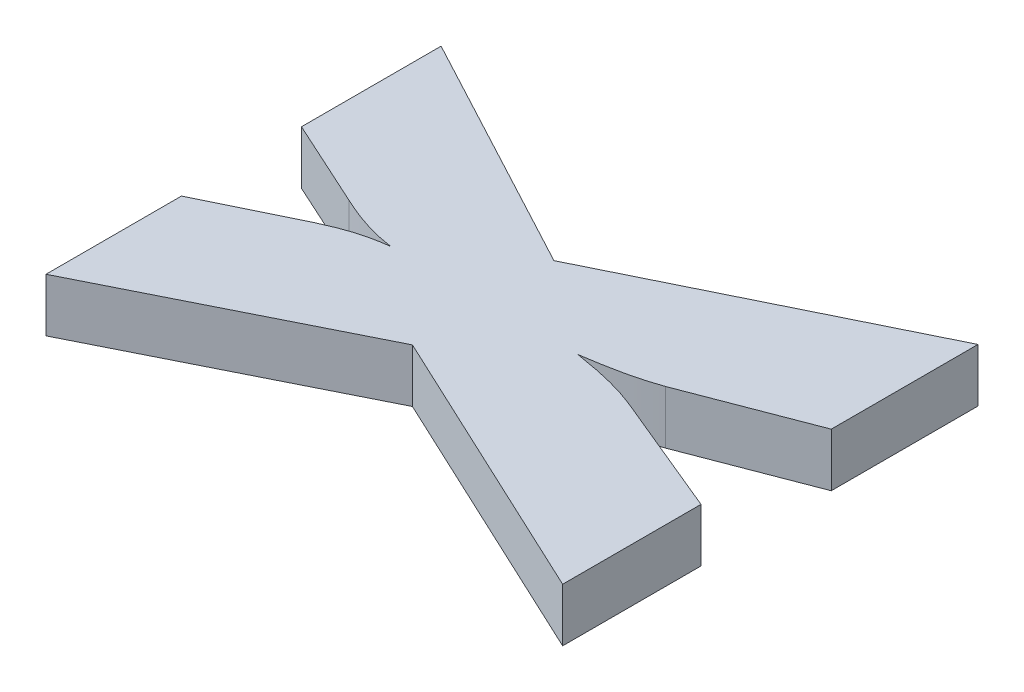
ISO-10303-21;
HEADER;
FILE_DESCRIPTION(('STEP AP214'),'2;1');
FILE_NAME('part.step','',(''),(''),'','','');
FILE_SCHEMA(('AUTOMOTIVE_DESIGN { 1 0 10303 214 1 1 1 1 }'));
ENDSEC;
DATA;
#1=APPLICATION_CONTEXT('core data for automotive mechanical design processes');
#2=APPLICATION_PROTOCOL_DEFINITION('international standard','automotive_design',2000,#1);
#3=PRODUCT_CONTEXT('',#1,'mechanical');
#4=PRODUCT('Part','Part','',(#3));
#5=PRODUCT_RELATED_PRODUCT_CATEGORY('part','',(#4));
#6=PRODUCT_DEFINITION_FORMATION('','',#4);
#7=PRODUCT_DEFINITION_CONTEXT('part definition',#1,'design');
#8=PRODUCT_DEFINITION('design','',#6,#7);
#9=PRODUCT_DEFINITION_SHAPE('','',#8);
#10=(LENGTH_UNIT() NAMED_UNIT(*) SI_UNIT(.MILLI.,.METRE.));
#11=(NAMED_UNIT(*) PLANE_ANGLE_UNIT() SI_UNIT($,.RADIAN.));
#12=(NAMED_UNIT(*) SI_UNIT($,.STERADIAN.) SOLID_ANGLE_UNIT());
#13=UNCERTAINTY_MEASURE_WITH_UNIT(LENGTH_MEASURE(1.E-05),#10,'distance_accuracy_value','');
#14=(GEOMETRIC_REPRESENTATION_CONTEXT(3) GLOBAL_UNCERTAINTY_ASSIGNED_CONTEXT((#13)) GLOBAL_UNIT_ASSIGNED_CONTEXT((#10,
#11,#12)) REPRESENTATION_CONTEXT('',''));
#15=CARTESIAN_POINT('',(0.,0.,0.));
#16=DIRECTION('',(0.,0.,1.));
#17=DIRECTION('',(1.,0.,0.));
#18=AXIS2_PLACEMENT_3D('',#15,#16,#17);
#19=CARTESIAN_POINT('',(2.55,2.9956,1.5724228896104));
#20=DIRECTION('',(1.,0.,0.));
#21=DIRECTION('',(0.,-1.,0.));
#22=AXIS2_PLACEMENT_3D('',#19,#20,#21);
#23=PLANE('',#22);
#24=DIRECTION('',(0.,0.,1.));
#25=VECTOR('',#24,1.);
#26=CARTESIAN_POINT('',(2.55,2.9306,1.5724228896104));
#27=LINE('',#26,#25);
#28=CARTESIAN_POINT('',(2.55,2.9306,1.5724228896104));
#29=VERTEX_POINT('',#28);
#30=CARTESIAN_POINT('',(2.55,2.9306,1.7409090909091));
#31=VERTEX_POINT('',#30);
#32=EDGE_CURVE('E11',#29,#31,#27,.T.);
#33=ORIENTED_EDGE('',*,*,#32,.F.);
#34=DIRECTION('',(0.,-1.,0.));
#35=VECTOR('',#34,1.);
#36=CARTESIAN_POINT('',(2.55,2.9956,1.5724228896104));
#37=LINE('',#36,#35);
#38=CARTESIAN_POINT('',(2.55,2.9956,1.5724228896104));
#39=VERTEX_POINT('',#38);
#40=EDGE_CURVE('E24',#39,#29,#37,.T.);
#41=ORIENTED_EDGE('',*,*,#40,.F.);
#42=DIRECTION('',(0.,0.,1.));
#43=VECTOR('',#42,1.);
#44=CARTESIAN_POINT('',(2.55,2.9956,1.5724228896104));
#45=LINE('',#44,#43);
#46=CARTESIAN_POINT('',(2.55,2.9956,1.7409090909091));
#47=VERTEX_POINT('',#46);
#48=EDGE_CURVE('E309',#39,#47,#45,.T.);
#49=ORIENTED_EDGE('',*,*,#48,.T.);
#50=DIRECTION('',(0.,-1.,0.));
#51=VECTOR('',#50,1.);
#52=CARTESIAN_POINT('',(2.55,2.9956,1.7409090909091));
#53=LINE('',#52,#51);
#54=EDGE_CURVE('E150',#47,#31,#53,.T.);
#55=ORIENTED_EDGE('',*,*,#54,.T.);
#56=EDGE_LOOP('',(#33,#41,#49,#55));
#57=FACE_BOUND('',#56,.T.);
#58=ADVANCED_FACE('F17',(#57),#23,.T.);
#59=CARTESIAN_POINT('',(2.4029119318182,2.9956,1.5115056818182));
#60=DIRECTION('',(0.382636975883437,0.,-0.923898774047665));
#61=DIRECTION('',(-0.923898774047665,0.,-0.382636975883437));
#62=AXIS2_PLACEMENT_3D('',#59,#60,#61);
#63=PLANE('',#62);
#64=DIRECTION('',(0.923898774047665,0.,0.382636975883437));
#65=VECTOR('',#64,1.);
#66=CARTESIAN_POINT('',(2.4029119318182,2.9306,1.5115056818182));
#67=LINE('',#66,#65);
#68=CARTESIAN_POINT('',(2.4029119318182,2.9306,1.5115056818182));
#69=VERTEX_POINT('',#68);
#70=EDGE_CURVE('E306',#69,#29,#67,.T.);
#71=ORIENTED_EDGE('',*,*,#70,.F.);
#72=DIRECTION('',(0.,-1.,0.));
#73=VECTOR('',#72,1.);
#74=CARTESIAN_POINT('',(2.4029119318182,2.9956,1.5115056818182));
#75=LINE('',#74,#73);
#76=CARTESIAN_POINT('',(2.4029119318182,2.9956,1.5115056818182));
#77=VERTEX_POINT('',#76);
#78=EDGE_CURVE('E303',#77,#69,#75,.T.);
#79=ORIENTED_EDGE('',*,*,#78,.F.);
#80=DIRECTION('',(0.923898774047665,0.,0.382636975883437));
#81=VECTOR('',#80,1.);
#82=CARTESIAN_POINT('',(2.4029119318182,2.9956,1.5115056818182));
#83=LINE('',#82,#81);
#84=EDGE_CURVE('E297',#77,#39,#83,.T.);
#85=ORIENTED_EDGE('',*,*,#84,.T.);
#86=ORIENTED_EDGE('',*,*,#40,.T.);
#87=EDGE_LOOP('',(#71,#79,#85,#86));
#88=FACE_BOUND('',#87,.T.);
#89=ADVANCED_FACE('F311',(#88),#63,.T.);
#90=CARTESIAN_POINT('',(2.3171266233766,2.9956,1.4893364448052));
#91=CARTESIAN_POINT('',(2.3171266233766,2.9306,1.4893364448052));
#92=CARTESIAN_POINT('',(2.3251736277623,2.9956,1.4906735569569));
#93=CARTESIAN_POINT('',(2.3251736277623,2.9306,1.4906735569569));
#94=CARTESIAN_POINT('',(2.3407576884877,2.9956,1.493263046905));
#95=CARTESIAN_POINT('',(2.3407576884877,2.9306,1.493263046905));
#96=CARTESIAN_POINT('',(2.3631647904249,2.9956,1.4982782669108));
#97=CARTESIAN_POINT('',(2.3631647904249,2.9306,1.4982782669108));
#98=CARTESIAN_POINT('',(2.3838381065138,2.9956,1.5040867868663));
#99=CARTESIAN_POINT('',(2.3838381065138,2.9306,1.5040867868663));
#100=CARTESIAN_POINT('',(2.3967124783538,2.9956,1.5090943619452));
#101=CARTESIAN_POINT('',(2.3967124783538,2.9306,1.5090943619452));
#102=CARTESIAN_POINT('',(2.4029119318182,2.9956,1.5115056818182));
#103=CARTESIAN_POINT('',(2.4029119318182,2.9306,1.5115056818182));
#104=B_SPLINE_SURFACE_WITH_KNOTS('',3,1,((#90,#91),(#92,#93),(#94,#95),(#96,#97),(#98,#99),
(#100,#101),(#102,#103)),.UNSPECIFIED.,.F.,.F.,.F.,(4,1,1,1,4),(2,2),(0.,0.275517741586232,
0.533575602796007,0.77540058800198,1.),(0.,1.),.UNSPECIFIED.);
#105=CARTESIAN_POINT('',(2.3171266233766,2.9306,1.4893364448052));
#106=CARTESIAN_POINT('',(2.3251736277623,2.9306,1.4906735569569));
#107=CARTESIAN_POINT('',(2.3407576884877,2.9306,1.493263046905));
#108=CARTESIAN_POINT('',(2.3631647904249,2.9306,1.4982782669108));
#109=CARTESIAN_POINT('',(2.3838381065138,2.9306,1.5040867868663));
#110=CARTESIAN_POINT('',(2.3967124783538,2.9306,1.5090943619452));
#111=CARTESIAN_POINT('',(2.4029119318182,2.9306,1.5115056818182));
#112=B_SPLINE_CURVE_WITH_KNOTS('',3,(#105,#106,#107,#108,#109,#110,#111),.UNSPECIFIED.,.F.,.F.,
(4,1,1,1,4),(0.,0.275517741586232,0.533575602796007,0.77540058800198,1.),.UNSPECIFIED.);
#113=CARTESIAN_POINT('',(2.3171266233766,2.9306,1.4893364448052));
#114=VERTEX_POINT('',#113);
#115=EDGE_CURVE('E292',#114,#69,#112,.T.);
#116=DIRECTION('',(0.,-1.,0.));
#117=VECTOR('',#116,1.);
#118=CARTESIAN_POINT('',(2.3171266233766,2.9956,1.4893364448052));
#119=LINE('',#118,#117);
#120=CARTESIAN_POINT('',(2.3171266233766,2.9956,1.4893364448052));
#121=VERTEX_POINT('',#120);
#122=EDGE_CURVE('E286',#121,#114,#119,.T.);
#123=CARTESIAN_POINT('',(2.3171266233766,2.9956,1.4893364448052));
#124=CARTESIAN_POINT('',(2.3251736277623,2.9956,1.4906735569569));
#125=CARTESIAN_POINT('',(2.3407576884877,2.9956,1.493263046905));
#126=CARTESIAN_POINT('',(2.3631647904249,2.9956,1.4982782669108));
#127=CARTESIAN_POINT('',(2.3838381065138,2.9956,1.5040867868663));
#128=CARTESIAN_POINT('',(2.3967124783538,2.9956,1.5090943619452));
#129=CARTESIAN_POINT('',(2.4029119318182,2.9956,1.5115056818182));
#130=B_SPLINE_CURVE_WITH_KNOTS('',3,(#123,#124,#125,#126,#127,#128,#129),.UNSPECIFIED.,.F.,.F.,
(4,1,1,1,4),(0.,0.275517741586232,0.533575602796007,0.77540058800198,1.),.UNSPECIFIED.);
#131=EDGE_CURVE('E278',#121,#77,#130,.T.);
#132=ORIENTED_EDGE('',*,*,#115,.F.);
#133=ORIENTED_EDGE('',*,*,#122,.F.);
#134=ORIENTED_EDGE('',*,*,#131,.T.);
#135=ORIENTED_EDGE('',*,*,#78,.T.);
#136=EDGE_LOOP('',(#132,#133,#134,#135));
#137=FACE_BOUND('',#136,.T.);
#138=ADVANCED_FACE('F315',(#137),#104,.T.);
#139=CARTESIAN_POINT('',(2.4040685876623,2.9956,1.4696732954545));
#140=CARTESIAN_POINT('',(2.4040685876623,2.9306,1.4696732954545));
#141=CARTESIAN_POINT('',(2.3978598209841,2.9956,1.4717469444771));
#142=CARTESIAN_POINT('',(2.3978598209841,2.9306,1.4717469444771));
#143=CARTESIAN_POINT('',(2.3849227760133,2.9956,1.4760677527873));
#144=CARTESIAN_POINT('',(2.3849227760133,2.9306,1.4760677527873));
#145=CARTESIAN_POINT('',(2.3642208732788,2.9956,1.4811559121503));
#146=CARTESIAN_POINT('',(2.3642208732788,2.9306,1.4811559121503));
#147=CARTESIAN_POINT('',(2.3414255606766,2.9956,1.4855771500661));
#148=CARTESIAN_POINT('',(2.3414255606766,2.9306,1.4855771500661));
#149=CARTESIAN_POINT('',(2.3254897438753,2.9956,1.4880425843164));
#150=CARTESIAN_POINT('',(2.3254897438753,2.9306,1.4880425843164));
#151=CARTESIAN_POINT('',(2.3171266233766,2.9956,1.4893364448052));
#152=CARTESIAN_POINT('',(2.3171266233766,2.9306,1.4893364448052));
#153=B_SPLINE_SURFACE_WITH_KNOTS('',3,1,((#139,#140),(#141,#142),(#143,#144),(#145,#146),(#147,
#148),(#149,#150),(#151,#152)),.UNSPECIFIED.,.F.,.F.,.F.,(4,1,1,1,4),(2,2),(0.,
0.219889080717572,0.458177134566871,0.715651229614947,1.),(0.,1.),.UNSPECIFIED.);
#154=CARTESIAN_POINT('',(2.4040685876623,2.9306,1.4696732954545));
#155=CARTESIAN_POINT('',(2.3978598209841,2.9306,1.4717469444771));
#156=CARTESIAN_POINT('',(2.3849227760133,2.9306,1.4760677527873));
#157=CARTESIAN_POINT('',(2.3642208732788,2.9306,1.4811559121503));
#158=CARTESIAN_POINT('',(2.3414255606766,2.9306,1.4855771500661));
#159=CARTESIAN_POINT('',(2.3254897438753,2.9306,1.4880425843164));
#160=CARTESIAN_POINT('',(2.3171266233766,2.9306,1.4893364448052));
#161=B_SPLINE_CURVE_WITH_KNOTS('',3,(#154,#155,#156,#157,#158,#159,#160),.UNSPECIFIED.,.F.,.F.,
(4,1,1,1,4),(0.,0.219889080717572,0.458177134566871,0.715651229614947,1.),.UNSPECIFIED.);
#162=CARTESIAN_POINT('',(2.4040685876623,2.9306,1.4696732954545));
#163=VERTEX_POINT('',#162);
#164=EDGE_CURVE('E273',#163,#114,#161,.T.);
#165=DIRECTION('',(0.,-1.,0.));
#166=VECTOR('',#165,1.);
#167=CARTESIAN_POINT('',(2.4040685876623,2.9956,1.4696732954545));
#168=LINE('',#167,#166);
#169=CARTESIAN_POINT('',(2.4040685876623,2.9956,1.4696732954545));
#170=VERTEX_POINT('',#169);
#171=EDGE_CURVE('E267',#170,#163,#168,.T.);
#172=CARTESIAN_POINT('',(2.4040685876623,2.9956,1.4696732954545));
#173=CARTESIAN_POINT('',(2.3978598209841,2.9956,1.4717469444771));
#174=CARTESIAN_POINT('',(2.3849227760133,2.9956,1.4760677527873));
#175=CARTESIAN_POINT('',(2.3642208732788,2.9956,1.4811559121503));
#176=CARTESIAN_POINT('',(2.3414255606766,2.9956,1.4855771500661));
#177=CARTESIAN_POINT('',(2.3254897438753,2.9956,1.4880425843164));
#178=CARTESIAN_POINT('',(2.3171266233766,2.9956,1.4893364448052));
#179=B_SPLINE_CURVE_WITH_KNOTS('',3,(#172,#173,#174,#175,#176,#177,#178),.UNSPECIFIED.,.F.,.F.,
(4,1,1,1,4),(0.,0.219889080717572,0.458177134566871,0.715651229614947,1.),.UNSPECIFIED.);
#180=EDGE_CURVE('E262',#170,#121,#179,.T.);
#181=ORIENTED_EDGE('',*,*,#164,.F.);
#182=ORIENTED_EDGE('',*,*,#171,.F.);
#183=ORIENTED_EDGE('',*,*,#180,.T.);
#184=ORIENTED_EDGE('',*,*,#122,.T.);
#185=EDGE_LOOP('',(#181,#182,#183,#184));
#186=FACE_BOUND('',#185,.T.);
#187=ADVANCED_FACE('F318',(#186),#153,.T.);
#188=CARTESIAN_POINT('',(2.55,2.9956,1.413768262987));
#189=DIRECTION('',(0.35773882171526,0.,0.933821682891213));
#190=DIRECTION('',(0.933821682891213,0.,-0.35773882171526));
#191=AXIS2_PLACEMENT_3D('',#188,#189,#190);
#192=PLANE('',#191);
#193=DIRECTION('',(-0.933821682891213,0.,0.35773882171526));
#194=VECTOR('',#193,1.);
#195=CARTESIAN_POINT('',(2.55,2.9306,1.413768262987));
#196=LINE('',#195,#194);
#197=CARTESIAN_POINT('',(2.55,2.9306,1.413768262987));
#198=VERTEX_POINT('',#197);
#199=EDGE_CURVE('E259',#198,#163,#196,.T.);
#200=ORIENTED_EDGE('',*,*,#199,.F.);
#201=DIRECTION('',(0.,-1.,0.));
#202=VECTOR('',#201,1.);
#203=CARTESIAN_POINT('',(2.55,2.9956,1.413768262987));
#204=LINE('',#203,#202);
#205=CARTESIAN_POINT('',(2.55,2.9956,1.413768262987));
#206=VERTEX_POINT('',#205);
#207=EDGE_CURVE('E256',#206,#198,#204,.T.);
#208=ORIENTED_EDGE('',*,*,#207,.F.);
#209=DIRECTION('',(-0.933821682891213,0.,0.35773882171526));
#210=VECTOR('',#209,1.);
#211=CARTESIAN_POINT('',(2.55,2.9956,1.413768262987));
#212=LINE('',#211,#210);
#213=EDGE_CURVE('E253',#206,#170,#212,.T.);
#214=ORIENTED_EDGE('',*,*,#213,.T.);
#215=ORIENTED_EDGE('',*,*,#171,.T.);
#216=EDGE_LOOP('',(#200,#208,#214,#215));
#217=FACE_BOUND('',#216,.T.);
#218=ADVANCED_FACE('F323',(#217),#192,.T.);
#219=CARTESIAN_POINT('',(2.55,2.9956,1.2350649350649));
#220=DIRECTION('',(1.,0.,0.));
#221=DIRECTION('',(0.,-1.,0.));
#222=AXIS2_PLACEMENT_3D('',#219,#220,#221);
#223=PLANE('',#222);
#224=DIRECTION('',(0.,0.,1.));
#225=VECTOR('',#224,1.);
#226=CARTESIAN_POINT('',(2.55,2.9306,1.2350649350649));
#227=LINE('',#226,#225);
#228=CARTESIAN_POINT('',(2.55,2.9306,1.2350649350649));
#229=VERTEX_POINT('',#228);
#230=EDGE_CURVE('E250',#229,#198,#227,.T.);
#231=ORIENTED_EDGE('',*,*,#230,.F.);
#232=DIRECTION('',(0.,-1.,0.));
#233=VECTOR('',#232,1.);
#234=CARTESIAN_POINT('',(2.55,2.9956,1.2350649350649));
#235=LINE('',#234,#233);
#236=CARTESIAN_POINT('',(2.55,2.9956,1.2350649350649));
#237=VERTEX_POINT('',#236);
#238=EDGE_CURVE('E247',#237,#229,#235,.T.);
#239=ORIENTED_EDGE('',*,*,#238,.F.);
#240=DIRECTION('',(0.,0.,1.));
#241=VECTOR('',#240,1.);
#242=CARTESIAN_POINT('',(2.55,2.9956,1.2350649350649));
#243=LINE('',#242,#241);
#244=EDGE_CURVE('E244',#237,#206,#243,.T.);
#245=ORIENTED_EDGE('',*,*,#244,.T.);
#246=ORIENTED_EDGE('',*,*,#207,.T.);
#247=EDGE_LOOP('',(#231,#239,#245,#246));
#248=FACE_BOUND('',#247,.T.);
#249=ADVANCED_FACE('F325',(#248),#223,.T.);
#250=CARTESIAN_POINT('',(2.2033887987013,2.9956,1.4049005681818));
#251=DIRECTION('',(-0.440007192910873,0.,-0.897994248415152));
#252=DIRECTION('',(-0.897994248415152,0.,0.440007192910873));
#253=AXIS2_PLACEMENT_3D('',#250,#251,#252);
#254=PLANE('',#253);
#255=DIRECTION('',(0.897994248415152,0.,-0.440007192910873));
#256=VECTOR('',#255,1.);
#257=CARTESIAN_POINT('',(2.2033887987013,2.9306,1.4049005681818));
#258=LINE('',#257,#256);
#259=CARTESIAN_POINT('',(2.2033887987013,2.9306,1.4049005681818));
#260=VERTEX_POINT('',#259);
#261=EDGE_CURVE('E241',#260,#229,#258,.T.);
#262=ORIENTED_EDGE('',*,*,#261,.F.);
#263=DIRECTION('',(0.,-1.,0.));
#264=VECTOR('',#263,1.);
#265=CARTESIAN_POINT('',(2.2033887987013,2.9956,1.4049005681818));
#266=LINE('',#265,#264);
#267=CARTESIAN_POINT('',(2.2033887987013,2.9956,1.4049005681818));
#268=VERTEX_POINT('',#267);
#269=EDGE_CURVE('E238',#268,#260,#266,.T.);
#270=ORIENTED_EDGE('',*,*,#269,.F.);
#271=DIRECTION('',(0.897994248415152,0.,-0.440007192910873));
#272=VECTOR('',#271,1.);
#273=CARTESIAN_POINT('',(2.2033887987013,2.9956,1.4049005681818));
#274=LINE('',#273,#272);
#275=EDGE_CURVE('E235',#268,#237,#274,.T.);
#276=ORIENTED_EDGE('',*,*,#275,.T.);
#277=ORIENTED_EDGE('',*,*,#238,.T.);
#278=EDGE_LOOP('',(#262,#270,#276,#277));
#279=FACE_BOUND('',#278,.T.);
#280=ADVANCED_FACE('F327',(#279),#254,.T.);
#281=CARTESIAN_POINT('',(1.9084415584416,2.9956,1.2474025974026));
#282=DIRECTION('',(0.471037041403361,0.,-0.882113431269453));
#283=DIRECTION('',(-0.882113431269453,0.,-0.471037041403361));
#284=AXIS2_PLACEMENT_3D('',#281,#282,#283);
#285=PLANE('',#284);
#286=DIRECTION('',(0.882113431269453,0.,0.471037041403361));
#287=VECTOR('',#286,1.);
#288=CARTESIAN_POINT('',(1.9084415584416,2.9306,1.2474025974026));
#289=LINE('',#288,#287);
#290=CARTESIAN_POINT('',(1.9084415584416,2.9306,1.2474025974026));
#291=VERTEX_POINT('',#290);
#292=EDGE_CURVE('E232',#291,#260,#289,.T.);
#293=ORIENTED_EDGE('',*,*,#292,.F.);
#294=DIRECTION('',(0.,-1.,0.));
#295=VECTOR('',#294,1.);
#296=CARTESIAN_POINT('',(1.9084415584416,2.9956,1.2474025974026));
#297=LINE('',#296,#295);
#298=CARTESIAN_POINT('',(1.9084415584416,2.9956,1.2474025974026));
#299=VERTEX_POINT('',#298);
#300=EDGE_CURVE('E229',#299,#291,#297,.T.);
#301=ORIENTED_EDGE('',*,*,#300,.F.);
#302=DIRECTION('',(0.882113431269453,0.,0.471037041403361));
#303=VECTOR('',#302,1.);
#304=CARTESIAN_POINT('',(1.9084415584416,2.9956,1.2474025974026));
#305=LINE('',#304,#303);
#306=EDGE_CURVE('E226',#299,#268,#305,.T.);
#307=ORIENTED_EDGE('',*,*,#306,.T.);
#308=ORIENTED_EDGE('',*,*,#269,.T.);
#309=EDGE_LOOP('',(#293,#301,#307,#308));
#310=FACE_BOUND('',#309,.T.);
#311=ADVANCED_FACE('F330',(#310),#285,.T.);
#312=CARTESIAN_POINT('',(1.9084415584416,2.9956,1.4174310064935));
#313=DIRECTION('',(-1.,0.,0.));
#314=DIRECTION('',(0.,1.,0.));
#315=AXIS2_PLACEMENT_3D('',#312,#313,#314);
#316=PLANE('',#315);
#317=DIRECTION('',(0.,0.,-1.));
#318=VECTOR('',#317,1.);
#319=CARTESIAN_POINT('',(1.9084415584416,2.9306,1.4174310064935));
#320=LINE('',#319,#318);
#321=CARTESIAN_POINT('',(1.9084415584416,2.9306,1.4174310064935));
#322=VERTEX_POINT('',#321);
#323=EDGE_CURVE('E223',#322,#291,#320,.T.);
#324=ORIENTED_EDGE('',*,*,#323,.F.);
#325=DIRECTION('',(0.,-1.,0.));
#326=VECTOR('',#325,1.);
#327=CARTESIAN_POINT('',(1.9084415584416,2.9956,1.4174310064935));
#328=LINE('',#327,#326);
#329=CARTESIAN_POINT('',(1.9084415584416,2.9956,1.4174310064935));
#330=VERTEX_POINT('',#329);
#331=EDGE_CURVE('E220',#330,#322,#328,.T.);
#332=ORIENTED_EDGE('',*,*,#331,.F.);
#333=DIRECTION('',(0.,0.,-1.));
#334=VECTOR('',#333,1.);
#335=CARTESIAN_POINT('',(1.9084415584416,2.9956,1.4174310064935));
#336=LINE('',#335,#334);
#337=EDGE_CURVE('E217',#330,#299,#336,.T.);
#338=ORIENTED_EDGE('',*,*,#337,.T.);
#339=ORIENTED_EDGE('',*,*,#300,.T.);
#340=EDGE_LOOP('',(#324,#332,#338,#339));
#341=FACE_BOUND('',#340,.T.);
#342=ADVANCED_FACE('F335',(#341),#316,.T.);
#343=CARTESIAN_POINT('',(2.0144683441558,2.9956,1.465817775974));
#344=DIRECTION('',(-0.41517331976856,0.,0.909742334154212));
#345=DIRECTION('',(0.909742334154212,0.,0.41517331976856));
#346=AXIS2_PLACEMENT_3D('',#343,#344,#345);
#347=PLANE('',#346);
#348=DIRECTION('',(-0.909742334154212,0.,-0.41517331976856));
#349=VECTOR('',#348,1.);
#350=CARTESIAN_POINT('',(2.0144683441558,2.9306,1.465817775974));
#351=LINE('',#350,#349);
#352=CARTESIAN_POINT('',(2.0144683441558,2.9306,1.465817775974));
#353=VERTEX_POINT('',#352);
#354=EDGE_CURVE('E214',#353,#322,#351,.T.);
#355=ORIENTED_EDGE('',*,*,#354,.F.);
#356=DIRECTION('',(0.,-1.,0.));
#357=VECTOR('',#356,1.);
#358=CARTESIAN_POINT('',(2.0144683441558,2.9956,1.465817775974));
#359=LINE('',#358,#357);
#360=CARTESIAN_POINT('',(2.0144683441558,2.9956,1.465817775974));
#361=VERTEX_POINT('',#360);
#362=EDGE_CURVE('E211',#361,#353,#359,.T.);
#363=ORIENTED_EDGE('',*,*,#362,.F.);
#364=DIRECTION('',(-0.909742334154212,0.,-0.41517331976856));
#365=VECTOR('',#364,1.);
#366=CARTESIAN_POINT('',(2.0144683441558,2.9956,1.465817775974));
#367=LINE('',#366,#365);
#368=EDGE_CURVE('E205',#361,#330,#367,.T.);
#369=ORIENTED_EDGE('',*,*,#368,.T.);
#370=ORIENTED_EDGE('',*,*,#331,.T.);
#371=EDGE_LOOP('',(#355,#363,#369,#370));
#372=FACE_BOUND('',#371,.T.);
#373=ADVANCED_FACE('F337',(#372),#347,.T.);
#374=CARTESIAN_POINT('',(2.0888798701299,2.9956,1.4893364448052));
#375=CARTESIAN_POINT('',(2.0888798701299,2.9306,1.4893364448052));
#376=CARTESIAN_POINT('',(2.0829474450093,2.9956,1.4883426317064));
#377=CARTESIAN_POINT('',(2.0829474450093,2.9306,1.4883426317064));
#378=CARTESIAN_POINT('',(2.0707084116352,2.9956,1.4862923215151));
#379=CARTESIAN_POINT('',(2.0707084116352,2.9306,1.4862923215151));
#380=CARTESIAN_POINT('',(2.0523346460366,2.9956,1.4812152718836));
#381=CARTESIAN_POINT('',(2.0523346460366,2.9306,1.4812152718836));
#382=CARTESIAN_POINT('',(2.0334175994306,2.9956,1.4743740043909));
#383=CARTESIAN_POINT('',(2.0334175994306,2.9306,1.4743740043909));
#384=CARTESIAN_POINT('',(2.0209223705657,2.9956,1.4687319867633));
#385=CARTESIAN_POINT('',(2.0209223705657,2.9306,1.4687319867633));
#386=CARTESIAN_POINT('',(2.0144683441558,2.9956,1.465817775974));
#387=CARTESIAN_POINT('',(2.0144683441558,2.9306,1.465817775974));
#388=B_SPLINE_SURFACE_WITH_KNOTS('',3,1,((#374,#375),(#376,#377),(#378,#379),(#380,#381),(#382,
#383),(#384,#385),(#386,#387)),.UNSPECIFIED.,.F.,.F.,.F.,(4,1,1,1,4),(2,2),(0.,
0.230263938887362,0.475051597894126,0.728854038001127,1.),(0.,1.),.UNSPECIFIED.);
#389=CARTESIAN_POINT('',(2.0888798701299,2.9306,1.4893364448052));
#390=CARTESIAN_POINT('',(2.0829474450093,2.9306,1.4883426317064));
#391=CARTESIAN_POINT('',(2.0707084116352,2.9306,1.4862923215151));
#392=CARTESIAN_POINT('',(2.0523346460366,2.9306,1.4812152718836));
#393=CARTESIAN_POINT('',(2.0334175994306,2.9306,1.4743740043909));
#394=CARTESIAN_POINT('',(2.0209223705657,2.9306,1.4687319867633));
#395=CARTESIAN_POINT('',(2.0144683441558,2.9306,1.465817775974));
#396=B_SPLINE_CURVE_WITH_KNOTS('',3,(#389,#390,#391,#392,#393,#394,#395),.UNSPECIFIED.,.F.,.F.,
(4,1,1,1,4),(0.,0.230263938887362,0.475051597894126,0.728854038001127,1.),.UNSPECIFIED.);
#397=CARTESIAN_POINT('',(2.0888798701299,2.9306,1.4893364448052));
#398=VERTEX_POINT('',#397);
#399=EDGE_CURVE('E200',#398,#353,#396,.T.);
#400=DIRECTION('',(0.,-1.,0.));
#401=VECTOR('',#400,1.);
#402=CARTESIAN_POINT('',(2.0888798701299,2.9956,1.4893364448052));
#403=LINE('',#402,#401);
#404=CARTESIAN_POINT('',(2.0888798701299,2.9956,1.4893364448052));
#405=VERTEX_POINT('',#404);
#406=EDGE_CURVE('E194',#405,#398,#403,.T.);
#407=CARTESIAN_POINT('',(2.0888798701299,2.9956,1.4893364448052));
#408=CARTESIAN_POINT('',(2.0829474450093,2.9956,1.4883426317064));
#409=CARTESIAN_POINT('',(2.0707084116352,2.9956,1.4862923215151));
#410=CARTESIAN_POINT('',(2.0523346460366,2.9956,1.4812152718836));
#411=CARTESIAN_POINT('',(2.0334175994306,2.9956,1.4743740043909));
#412=CARTESIAN_POINT('',(2.0209223705657,2.9956,1.4687319867633));
#413=CARTESIAN_POINT('',(2.0144683441558,2.9956,1.465817775974));
#414=B_SPLINE_CURVE_WITH_KNOTS('',3,(#407,#408,#409,#410,#411,#412,#413),.UNSPECIFIED.,.F.,.F.,
(4,1,1,1,4),(0.,0.230263938887362,0.475051597894126,0.728854038001127,1.),.UNSPECIFIED.);
#415=EDGE_CURVE('E186',#405,#361,#414,.T.);
#416=ORIENTED_EDGE('',*,*,#399,.F.);
#417=ORIENTED_EDGE('',*,*,#406,.F.);
#418=ORIENTED_EDGE('',*,*,#415,.T.);
#419=ORIENTED_EDGE('',*,*,#362,.T.);
#420=EDGE_LOOP('',(#416,#417,#418,#419));
#421=FACE_BOUND('',#420,.T.);
#422=ADVANCED_FACE('F339',(#421),#388,.T.);
#423=CARTESIAN_POINT('',(2.015625,2.9956,1.5115056818182));
#424=CARTESIAN_POINT('',(2.015625,2.9306,1.5115056818182));
#425=CARTESIAN_POINT('',(2.0224585005698,2.9956,1.5084481518895));
#426=CARTESIAN_POINT('',(2.0224585005698,2.9306,1.5084481518895));
#427=CARTESIAN_POINT('',(2.0351925826025,2.9956,1.5027505103174));
#428=CARTESIAN_POINT('',(2.0351925826025,2.9306,1.5027505103174));
#429=CARTESIAN_POINT('',(2.0539895840883,2.9956,1.4961313668195));
#430=CARTESIAN_POINT('',(2.0539895840883,2.9306,1.4961313668195));
#431=CARTESIAN_POINT('',(2.0716410621287,2.9956,1.4917920316121));
#432=CARTESIAN_POINT('',(2.0716410621287,2.9306,1.4917920316121));
#433=CARTESIAN_POINT('',(2.0832087685721,2.9956,1.4901442664461));
#434=CARTESIAN_POINT('',(2.0832087685721,2.9306,1.4901442664461));
#435=CARTESIAN_POINT('',(2.0888798701299,2.9956,1.4893364448052));
#436=CARTESIAN_POINT('',(2.0888798701299,2.9306,1.4893364448052));
#437=B_SPLINE_SURFACE_WITH_KNOTS('',3,1,((#423,#424),(#425,#426),(#427,#428),(#429,#430),(#431,
#432),(#433,#434),(#435,#436)),.UNSPECIFIED.,.F.,.F.,.F.,(4,1,1,1,4),(2,2),(0.,
0.292052870099084,0.544234271691691,0.77655953283142,1.),(0.,1.),.UNSPECIFIED.);
#438=CARTESIAN_POINT('',(2.015625,2.9306,1.5115056818182));
#439=CARTESIAN_POINT('',(2.0224585005698,2.9306,1.5084481518895));
#440=CARTESIAN_POINT('',(2.0351925826025,2.9306,1.5027505103174));
#441=CARTESIAN_POINT('',(2.0539895840883,2.9306,1.4961313668195));
#442=CARTESIAN_POINT('',(2.0716410621287,2.9306,1.4917920316121));
#443=CARTESIAN_POINT('',(2.0832087685721,2.9306,1.4901442664461));
#444=CARTESIAN_POINT('',(2.0888798701299,2.9306,1.4893364448052));
#445=B_SPLINE_CURVE_WITH_KNOTS('',3,(#438,#439,#440,#441,#442,#443,#444),.UNSPECIFIED.,.F.,.F.,
(4,1,1,1,4),(0.,0.292052870099084,0.544234271691691,0.77655953283142,1.),.UNSPECIFIED.);
#446=CARTESIAN_POINT('',(2.015625,2.9306,1.5115056818182));
#447=VERTEX_POINT('',#446);
#448=EDGE_CURVE('E181',#447,#398,#445,.T.);
#449=DIRECTION('',(0.,-1.,0.));
#450=VECTOR('',#449,1.);
#451=CARTESIAN_POINT('',(2.015625,2.9956,1.5115056818182));
#452=LINE('',#451,#450);
#453=CARTESIAN_POINT('',(2.015625,2.9956,1.5115056818182));
#454=VERTEX_POINT('',#453);
#455=EDGE_CURVE('E175',#454,#447,#452,.T.);
#456=CARTESIAN_POINT('',(2.015625,2.9956,1.5115056818182));
#457=CARTESIAN_POINT('',(2.0224585005698,2.9956,1.5084481518895));
#458=CARTESIAN_POINT('',(2.0351925826025,2.9956,1.5027505103174));
#459=CARTESIAN_POINT('',(2.0539895840883,2.9956,1.4961313668195));
#460=CARTESIAN_POINT('',(2.0716410621287,2.9956,1.4917920316121));
#461=CARTESIAN_POINT('',(2.0832087685721,2.9956,1.4901442664461));
#462=CARTESIAN_POINT('',(2.0888798701299,2.9956,1.4893364448052));
#463=B_SPLINE_CURVE_WITH_KNOTS('',3,(#456,#457,#458,#459,#460,#461,#462),.UNSPECIFIED.,.F.,.F.,
(4,1,1,1,4),(0.,0.292052870099084,0.544234271691691,0.77655953283142,1.),.UNSPECIFIED.);
#464=EDGE_CURVE('E170',#454,#405,#463,.T.);
#465=ORIENTED_EDGE('',*,*,#448,.F.);
#466=ORIENTED_EDGE('',*,*,#455,.F.);
#467=ORIENTED_EDGE('',*,*,#464,.T.);
#468=ORIENTED_EDGE('',*,*,#406,.T.);
#469=EDGE_LOOP('',(#465,#466,#467,#468));
#470=FACE_BOUND('',#469,.T.);
#471=ADVANCED_FACE('F342',(#470),#437,.T.);
#472=CARTESIAN_POINT('',(1.9084415584416,2.9956,1.5635551948052));
#473=DIRECTION('',(-0.436829158053176,0.,-0.899544488435426));
#474=DIRECTION('',(-0.899544488435426,0.,0.436829158053176));
#475=AXIS2_PLACEMENT_3D('',#472,#473,#474);
#476=PLANE('',#475);
#477=DIRECTION('',(0.899544488435426,0.,-0.436829158053176));
#478=VECTOR('',#477,1.);
#479=CARTESIAN_POINT('',(1.9084415584416,2.9306,1.5635551948052));
#480=LINE('',#479,#478);
#481=CARTESIAN_POINT('',(1.9084415584416,2.9306,1.5635551948052));
#482=VERTEX_POINT('',#481);
#483=EDGE_CURVE('E167',#482,#447,#480,.T.);
#484=ORIENTED_EDGE('',*,*,#483,.F.);
#485=DIRECTION('',(0.,-1.,0.));
#486=VECTOR('',#485,1.);
#487=CARTESIAN_POINT('',(1.9084415584416,2.9956,1.5635551948052));
#488=LINE('',#487,#486);
#489=CARTESIAN_POINT('',(1.9084415584416,2.9956,1.5635551948052));
#490=VERTEX_POINT('',#489);
#491=EDGE_CURVE('E164',#490,#482,#488,.T.);
#492=ORIENTED_EDGE('',*,*,#491,.F.);
#493=DIRECTION('',(0.899544488435426,0.,-0.436829158053176));
#494=VECTOR('',#493,1.);
#495=CARTESIAN_POINT('',(1.9084415584416,2.9956,1.5635551948052));
#496=LINE('',#495,#494);
#497=EDGE_CURVE('E161',#490,#454,#496,.T.);
#498=ORIENTED_EDGE('',*,*,#497,.T.);
#499=ORIENTED_EDGE('',*,*,#455,.T.);
#500=EDGE_LOOP('',(#484,#492,#498,#499));
#501=FACE_BOUND('',#500,.T.);
#502=ADVANCED_FACE('F345',(#501),#476,.T.);
#503=CARTESIAN_POINT('',(1.9084415584416,2.9956,1.7285714285714));
#504=DIRECTION('',(-1.,0.,0.));
#505=DIRECTION('',(0.,1.,0.));
#506=AXIS2_PLACEMENT_3D('',#503,#504,#505);
#507=PLANE('',#506);
#508=DIRECTION('',(0.,0.,-1.));
#509=VECTOR('',#508,1.);
#510=CARTESIAN_POINT('',(1.9084415584416,2.9306,1.7285714285714));
#511=LINE('',#510,#509);
#512=CARTESIAN_POINT('',(1.9084415584416,2.9306,1.7285714285714));
#513=VERTEX_POINT('',#512);
#514=EDGE_CURVE('E158',#513,#482,#511,.T.);
#515=ORIENTED_EDGE('',*,*,#514,.F.);
#516=DIRECTION('',(0.,-1.,0.));
#517=VECTOR('',#516,1.);
#518=CARTESIAN_POINT('',(1.9084415584416,2.9956,1.7285714285714));
#519=LINE('',#518,#517);
#520=CARTESIAN_POINT('',(1.9084415584416,2.9956,1.7285714285714));
#521=VERTEX_POINT('',#520);
#522=EDGE_CURVE('E156',#521,#513,#519,.T.);
#523=ORIENTED_EDGE('',*,*,#522,.F.);
#524=DIRECTION('',(0.,0.,-1.));
#525=VECTOR('',#524,1.);
#526=CARTESIAN_POINT('',(1.9084415584416,2.9956,1.7285714285714));
#527=LINE('',#526,#525);
#528=EDGE_CURVE('E145',#521,#490,#527,.T.);
#529=ORIENTED_EDGE('',*,*,#528,.T.);
#530=ORIENTED_EDGE('',*,*,#491,.T.);
#531=EDGE_LOOP('',(#515,#523,#529,#530));
#532=FACE_BOUND('',#531,.T.);
#533=ADVANCED_FACE('F347',(#532),#507,.T.);
#534=CARTESIAN_POINT('',(2.2060876623377,2.9956,1.5799411525974));
#535=DIRECTION('',(0.446749981631432,0.,0.894658847780714));
#536=DIRECTION('',(0.894658847780714,0.,-0.446749981631432));
#537=AXIS2_PLACEMENT_3D('',#534,#535,#536);
#538=PLANE('',#537);
#539=DIRECTION('',(-0.894658847780714,0.,0.446749981631432));
#540=VECTOR('',#539,1.);
#541=CARTESIAN_POINT('',(2.2060876623377,2.9306,1.5799411525974));
#542=LINE('',#541,#540);
#543=CARTESIAN_POINT('',(2.2060876623377,2.9306,1.5799411525974));
#544=VERTEX_POINT('',#543);
#545=EDGE_CURVE('E132',#544,#513,#542,.T.);
#546=ORIENTED_EDGE('',*,*,#545,.F.);
#547=DIRECTION('',(0.,-1.,0.));
#548=VECTOR('',#547,1.);
#549=CARTESIAN_POINT('',(2.2060876623377,2.9956,1.5799411525974));
#550=LINE('',#549,#548);
#551=CARTESIAN_POINT('',(2.2060876623377,2.9956,1.5799411525974));
#552=VERTEX_POINT('',#551);
#553=EDGE_CURVE('E126',#552,#544,#550,.T.);
#554=ORIENTED_EDGE('',*,*,#553,.F.);
#555=DIRECTION('',(-0.894658847780714,0.,0.446749981631432));
#556=VECTOR('',#555,1.);
#557=CARTESIAN_POINT('',(2.2060876623377,2.9956,1.5799411525974));
#558=LINE('',#557,#556);
#559=EDGE_CURVE('E130',#552,#521,#558,.T.);
#560=ORIENTED_EDGE('',*,*,#559,.T.);
#561=ORIENTED_EDGE('',*,*,#522,.T.);
#562=EDGE_LOOP('',(#546,#554,#560,#561));
#563=FACE_BOUND('',#562,.T.);
#564=ADVANCED_FACE('F128',(#563),#538,.T.);
#565=CARTESIAN_POINT('',(2.55,2.9956,1.7409090909091));
#566=DIRECTION('',(-0.423913524728884,0.,0.90570266840279));
#567=DIRECTION('',(0.90570266840279,0.,0.423913524728884));
#568=AXIS2_PLACEMENT_3D('',#565,#566,#567);
#569=PLANE('',#568);
#570=DIRECTION('',(-0.90570266840279,0.,-0.423913524728884));
#571=VECTOR('',#570,1.);
#572=CARTESIAN_POINT('',(2.55,2.9306,1.7409090909091));
#573=LINE('',#572,#571);
#574=EDGE_CURVE('E146',#31,#544,#573,.T.);
#575=ORIENTED_EDGE('',*,*,#574,.F.);
#576=ORIENTED_EDGE('',*,*,#54,.F.);
#577=DIRECTION('',(-0.90570266840279,0.,-0.423913524728884));
#578=VECTOR('',#577,1.);
#579=CARTESIAN_POINT('',(2.55,2.9956,1.7409090909091));
#580=LINE('',#579,#578);
#581=EDGE_CURVE('E142',#47,#552,#580,.T.);
#582=ORIENTED_EDGE('',*,*,#581,.T.);
#583=ORIENTED_EDGE('',*,*,#553,.T.);
#584=EDGE_LOOP('',(#575,#576,#582,#583));
#585=FACE_BOUND('',#584,.T.);
#586=ADVANCED_FACE('F149',(#585),#569,.T.);
#587=CARTESIAN_POINT('',(2.051312149721,2.9956,1.4972706637725));
#588=DIRECTION('',(2.16657012416225E-13,1.,4.84222837493083E-13));
#589=DIRECTION('',(0.,-4.84222837493083E-13,1.));
#590=AXIS2_PLACEMENT_3D('',#587,#588,#589);
#591=PLANE('',#590);
#592=ORIENTED_EDGE('',*,*,#48,.F.);
#593=ORIENTED_EDGE('',*,*,#84,.F.);
#594=ORIENTED_EDGE('',*,*,#131,.F.);
#595=ORIENTED_EDGE('',*,*,#180,.F.);
#596=ORIENTED_EDGE('',*,*,#213,.F.);
#597=ORIENTED_EDGE('',*,*,#244,.F.);
#598=ORIENTED_EDGE('',*,*,#275,.F.);
#599=ORIENTED_EDGE('',*,*,#306,.F.);
#600=ORIENTED_EDGE('',*,*,#337,.F.);
#601=ORIENTED_EDGE('',*,*,#368,.F.);
#602=ORIENTED_EDGE('',*,*,#415,.F.);
#603=ORIENTED_EDGE('',*,*,#464,.F.);
#604=ORIENTED_EDGE('',*,*,#497,.F.);
#605=ORIENTED_EDGE('',*,*,#528,.F.);
#606=ORIENTED_EDGE('',*,*,#559,.F.);
#607=ORIENTED_EDGE('',*,*,#581,.F.);
#608=EDGE_LOOP('',(#592,#593,#594,#595,#596,#597,#598,#599,#600,#601,#602,#603,#604,#605,#606,#607));
#609=FACE_BOUND('',#608,.T.);
#610=ADVANCED_FACE('F141',(#609),#591,.T.);
#611=CARTESIAN_POINT('',(2.051312149721,2.9306,1.4972706637725));
#612=DIRECTION('',(2.16657012416225E-13,1.,4.84222837493083E-13));
#613=DIRECTION('',(0.,-4.84222837493083E-13,1.));
#614=AXIS2_PLACEMENT_3D('',#611,#612,#613);
#615=PLANE('',#614);
#616=ORIENTED_EDGE('',*,*,#32,.T.);
#617=ORIENTED_EDGE('',*,*,#574,.T.);
#618=ORIENTED_EDGE('',*,*,#545,.T.);
#619=ORIENTED_EDGE('',*,*,#514,.T.);
#620=ORIENTED_EDGE('',*,*,#483,.T.);
#621=ORIENTED_EDGE('',*,*,#448,.T.);
#622=ORIENTED_EDGE('',*,*,#399,.T.);
#623=ORIENTED_EDGE('',*,*,#354,.T.);
#624=ORIENTED_EDGE('',*,*,#323,.T.);
#625=ORIENTED_EDGE('',*,*,#292,.T.);
#626=ORIENTED_EDGE('',*,*,#261,.T.);
#627=ORIENTED_EDGE('',*,*,#230,.T.);
#628=ORIENTED_EDGE('',*,*,#199,.T.);
#629=ORIENTED_EDGE('',*,*,#164,.T.);
#630=ORIENTED_EDGE('',*,*,#115,.T.);
#631=ORIENTED_EDGE('',*,*,#70,.T.);
#632=EDGE_LOOP('',(#616,#617,#618,#619,#620,#621,#622,#623,#624,#625,#626,#627,#628,#629,#630,#631));
#633=FACE_BOUND('',#632,.T.);
#634=ADVANCED_FACE('F313',(#633),#615,.F.);
#635=CLOSED_SHELL('',(#58,#89,#138,#187,#218,#249,#280,#311,#342,#373,#422,#471,#502,#533,#564,
#586,#610,#634));
#636=MANIFOLD_SOLID_BREP('B1',#635);
#637=ADVANCED_BREP_SHAPE_REPRESENTATION('',(#18,#636),#14);
#638=SHAPE_DEFINITION_REPRESENTATION(#9,#637);
ENDSEC;
END-ISO-10303-21;
